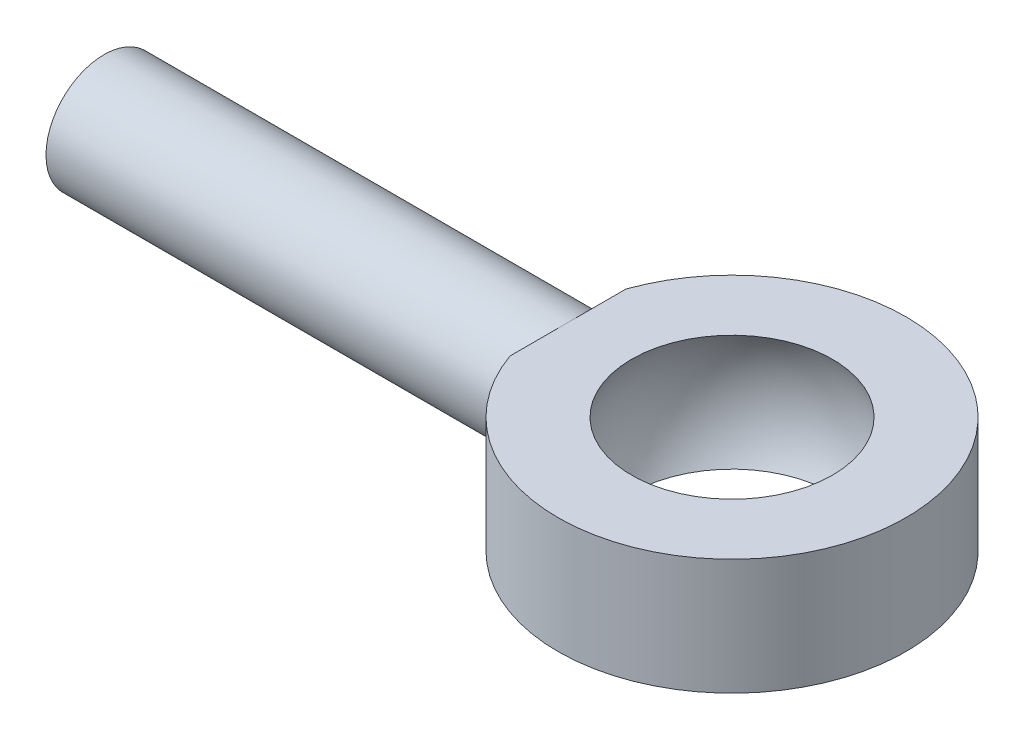
ISO-10303-21;
HEADER;
FILE_DESCRIPTION(('STEP AP214'),'2;1');
FILE_NAME('part.step','',(''),(''),'','','');
FILE_SCHEMA(('AUTOMOTIVE_DESIGN { 1 0 10303 214 1 1 1 1 }'));
ENDSEC;
DATA;
#1=APPLICATION_CONTEXT('core data for automotive mechanical design processes');
#2=APPLICATION_PROTOCOL_DEFINITION('international standard','automotive_design',2000,#1);
#3=PRODUCT_CONTEXT('',#1,'mechanical');
#4=PRODUCT('Part','Part','',(#3));
#5=PRODUCT_RELATED_PRODUCT_CATEGORY('part','',(#4));
#6=PRODUCT_DEFINITION_FORMATION('','',#4);
#7=PRODUCT_DEFINITION_CONTEXT('part definition',#1,'design');
#8=PRODUCT_DEFINITION('design','',#6,#7);
#9=PRODUCT_DEFINITION_SHAPE('','',#8);
#10=(LENGTH_UNIT() NAMED_UNIT(*) SI_UNIT(.MILLI.,.METRE.));
#11=(NAMED_UNIT(*) PLANE_ANGLE_UNIT() SI_UNIT($,.RADIAN.));
#12=(NAMED_UNIT(*) SI_UNIT($,.STERADIAN.) SOLID_ANGLE_UNIT());
#13=UNCERTAINTY_MEASURE_WITH_UNIT(LENGTH_MEASURE(1.E-05),#10,'distance_accuracy_value','');
#14=(GEOMETRIC_REPRESENTATION_CONTEXT(3) GLOBAL_UNCERTAINTY_ASSIGNED_CONTEXT((#13)) GLOBAL_UNIT_ASSIGNED_CONTEXT((#10,
#11,#12)) REPRESENTATION_CONTEXT('',''));
#15=CARTESIAN_POINT('',(0.,0.,0.));
#16=DIRECTION('',(0.,0.,1.));
#17=DIRECTION('',(1.,0.,0.));
#18=AXIS2_PLACEMENT_3D('',#15,#16,#17);
#19=CARTESIAN_POINT('',(0.,6.35,0.));
#20=DIRECTION('',(0.,-1.,0.));
#21=DIRECTION('',(0.,0.,-1.));
#22=AXIS2_PLACEMENT_3D('',#19,#20,#21);
#23=PLANE('',#22);
#24=CARTESIAN_POINT('',(0.,6.35,0.));
#25=DIRECTION('',(0.,1.,0.));
#26=DIRECTION('',(0.,0.,-1.));
#27=AXIS2_PLACEMENT_3D('',#24,#25,#26);
#28=CIRCLE('',#27,9.525);
#29=CARTESIAN_POINT('',(-8.98025612106915,6.35,3.175));
#30=VERTEX_POINT('',#29);
#31=CARTESIAN_POINT('',(-8.98025612106915,6.35,-3.175));
#32=VERTEX_POINT('',#31);
#33=EDGE_CURVE('E101',#30,#32,#28,.T.);
#34=ORIENTED_EDGE('',*,*,#33,.T.);
#35=DIRECTION('',(0.,0.,1.));
#36=VECTOR('',#35,1.);
#37=CARTESIAN_POINT('',(-8.98025612106915,6.35,-3.175));
#38=LINE('',#37,#36);
#39=CARTESIAN_POINT('',(-8.98025612106915,6.35,0.));
#40=VERTEX_POINT('',#39);
#41=EDGE_CURVE('E76',#32,#40,#38,.T.);
#42=ORIENTED_EDGE('',*,*,#41,.T.);
#43=EDGE_CURVE('E103',#40,#30,#38,.T.);
#44=ORIENTED_EDGE('',*,*,#43,.T.);
#45=EDGE_LOOP('',(#34,#42,#44));
#46=FACE_BOUND('',#45,.T.);
#47=CARTESIAN_POINT('',(0.,6.35,0.));
#48=DIRECTION('',(0.,-1.,0.));
#49=DIRECTION('',(0.,0.,-1.));
#50=AXIS2_PLACEMENT_3D('',#47,#48,#49);
#51=CIRCLE('',#50,5.49926131403118);
#52=CARTESIAN_POINT('',(5.49926131403118,6.35,0.));
#53=VERTEX_POINT('',#52);
#54=EDGE_CURVE('E122',#53,#53,#51,.F.);
#55=ORIENTED_EDGE('',*,*,#54,.F.);
#56=EDGE_LOOP('',(#55));
#57=FACE_BOUND('',#56,.T.);
#58=ADVANCED_FACE('F33',(#46,#57),#23,.F.);
#59=CARTESIAN_POINT('',(0.,0.,0.));
#60=DIRECTION('',(0.,-1.,0.));
#61=DIRECTION('',(0.,0.,-1.));
#62=AXIS2_PLACEMENT_3D('',#59,#60,#61);
#63=PLANE('',#62);
#64=CARTESIAN_POINT('',(0.,0.,0.));
#65=DIRECTION('',(0.,1.,0.));
#66=DIRECTION('',(0.,0.,-1.));
#67=AXIS2_PLACEMENT_3D('',#64,#65,#66);
#68=CIRCLE('',#67,9.525);
#69=CARTESIAN_POINT('',(-8.98025612106915,0.,3.175));
#70=VERTEX_POINT('',#69);
#71=CARTESIAN_POINT('',(-8.98025612106915,0.,-3.175));
#72=VERTEX_POINT('',#71);
#73=EDGE_CURVE('E83',#70,#72,#68,.T.);
#74=ORIENTED_EDGE('',*,*,#73,.F.);
#75=DIRECTION('',(0.,0.,1.));
#76=VECTOR('',#75,1.);
#77=CARTESIAN_POINT('',(-8.98025612106915,0.,-3.175));
#78=LINE('',#77,#76);
#79=CARTESIAN_POINT('',(-8.98025612106915,0.,0.));
#80=VERTEX_POINT('',#79);
#81=EDGE_CURVE('E107',#80,#70,#78,.T.);
#82=ORIENTED_EDGE('',*,*,#81,.F.);
#83=EDGE_CURVE('E91',#72,#80,#78,.T.);
#84=ORIENTED_EDGE('',*,*,#83,.F.);
#85=EDGE_LOOP('',(#74,#82,#84));
#86=FACE_BOUND('',#85,.T.);
#87=CARTESIAN_POINT('',(0.,0.,0.));
#88=DIRECTION('',(0.,-1.,0.));
#89=DIRECTION('',(0.,0.,-1.));
#90=AXIS2_PLACEMENT_3D('',#87,#88,#89);
#91=CIRCLE('',#90,5.49926131403118);
#92=CARTESIAN_POINT('',(5.49926131403118,0.,0.));
#93=VERTEX_POINT('',#92);
#94=EDGE_CURVE('E37',#93,#93,#91,.F.);
#95=ORIENTED_EDGE('',*,*,#94,.T.);
#96=EDGE_LOOP('',(#95));
#97=FACE_BOUND('',#96,.T.);
#98=ADVANCED_FACE('F115',(#86,#97),#63,.T.);
#99=CARTESIAN_POINT('',(-8.98025612106915,6.35,-3.175));
#100=DIRECTION('',(1.,0.,0.));
#101=DIRECTION('',(0.,0.,-1.));
#102=AXIS2_PLACEMENT_3D('',#99,#100,#101);
#103=PLANE('',#102);
#104=CARTESIAN_POINT('',(-8.98025612106915,3.175,0.));
#105=DIRECTION('',(-1.,0.,0.));
#106=DIRECTION('',(0.,0.,1.));
#107=AXIS2_PLACEMENT_3D('',#104,#105,#106);
#108=CIRCLE('',#107,3.175);
#109=CARTESIAN_POINT('',(-8.98025612106915,3.175,-3.175));
#110=VERTEX_POINT('',#109);
#111=EDGE_CURVE('E89',#110,#80,#108,.T.);
#112=ORIENTED_EDGE('',*,*,#111,.F.);
#113=DIRECTION('',(0.,-1.,0.));
#114=VECTOR('',#113,1.);
#115=CARTESIAN_POINT('',(-8.98025612106915,6.35,-3.175));
#116=LINE('',#115,#114);
#117=EDGE_CURVE('E42',#110,#72,#116,.T.);
#118=ORIENTED_EDGE('',*,*,#117,.T.);
#119=ORIENTED_EDGE('',*,*,#83,.T.);
#120=EDGE_LOOP('',(#112,#118,#119));
#121=FACE_BOUND('',#120,.T.);
#122=ADVANCED_FACE('F90',(#121),#103,.F.);
#123=CARTESIAN_POINT('',(-8.98025612106915,3.175,3.175));
#124=VERTEX_POINT('',#123);
#125=EDGE_CURVE('E94',#80,#124,#108,.T.);
#126=ORIENTED_EDGE('',*,*,#125,.F.);
#127=ORIENTED_EDGE('',*,*,#81,.T.);
#128=DIRECTION('',(0.,-1.,0.));
#129=VECTOR('',#128,1.);
#130=CARTESIAN_POINT('',(-8.98025612106915,6.35,3.175));
#131=LINE('',#130,#129);
#132=EDGE_CURVE('E105',#124,#70,#131,.T.);
#133=ORIENTED_EDGE('',*,*,#132,.F.);
#134=EDGE_LOOP('',(#126,#127,#133));
#135=FACE_BOUND('',#134,.T.);
#136=ADVANCED_FACE('F113',(#135),#103,.F.);
#137=EDGE_CURVE('E49',#124,#40,#108,.T.);
#138=ORIENTED_EDGE('',*,*,#137,.F.);
#139=EDGE_CURVE('E87',#30,#124,#131,.T.);
#140=ORIENTED_EDGE('',*,*,#139,.F.);
#141=ORIENTED_EDGE('',*,*,#43,.F.);
#142=EDGE_LOOP('',(#138,#140,#141));
#143=FACE_BOUND('',#142,.T.);
#144=ADVANCED_FACE('F139',(#143),#103,.F.);
#145=EDGE_CURVE('E56',#40,#110,#108,.T.);
#146=ORIENTED_EDGE('',*,*,#145,.F.);
#147=ORIENTED_EDGE('',*,*,#41,.F.);
#148=EDGE_CURVE('E11',#32,#110,#116,.T.);
#149=ORIENTED_EDGE('',*,*,#148,.T.);
#150=EDGE_LOOP('',(#146,#147,#149));
#151=FACE_BOUND('',#150,.T.);
#152=ADVANCED_FACE('F74',(#151),#103,.F.);
#153=CARTESIAN_POINT('',(0.,6.35,0.));
#154=DIRECTION('',(0.,-1.,0.));
#155=DIRECTION('',(0.,0.,-1.));
#156=AXIS2_PLACEMENT_3D('',#153,#154,#155);
#157=CYLINDRICAL_SURFACE('',#156,9.525);
#158=ORIENTED_EDGE('',*,*,#73,.T.);
#159=ORIENTED_EDGE('',*,*,#117,.F.);
#160=ORIENTED_EDGE('',*,*,#148,.F.);
#161=ORIENTED_EDGE('',*,*,#33,.F.);
#162=ORIENTED_EDGE('',*,*,#139,.T.);
#163=ORIENTED_EDGE('',*,*,#132,.T.);
#164=EDGE_LOOP('',(#158,#159,#160,#161,#162,#163));
#165=FACE_BOUND('',#164,.T.);
#166=ADVANCED_FACE('F35',(#165),#157,.T.);
#167=CARTESIAN_POINT('',(-34.3802561210692,3.175,0.));
#168=DIRECTION('',(1.,0.,0.));
#169=DIRECTION('',(0.,0.,-1.));
#170=AXIS2_PLACEMENT_3D('',#167,#168,#169);
#171=CYLINDRICAL_SURFACE('',#170,3.175);
#172=CARTESIAN_POINT('',(-34.3802561210692,3.175,0.));
#173=DIRECTION('',(-1.,0.,0.));
#174=DIRECTION('',(0.,0.,1.));
#175=AXIS2_PLACEMENT_3D('',#172,#173,#174);
#176=CIRCLE('',#175,3.175);
#177=CARTESIAN_POINT('',(-34.3802561210692,3.175,3.175));
#178=VERTEX_POINT('',#177);
#179=EDGE_CURVE('E97',#178,#178,#176,.T.);
#180=ORIENTED_EDGE('',*,*,#179,.F.);
#181=EDGE_LOOP('',(#180));
#182=FACE_BOUND('',#181,.T.);
#183=ORIENTED_EDGE('',*,*,#137,.T.);
#184=ORIENTED_EDGE('',*,*,#145,.T.);
#185=ORIENTED_EDGE('',*,*,#111,.T.);
#186=ORIENTED_EDGE('',*,*,#125,.T.);
#187=EDGE_LOOP('',(#183,#184,#185,#186));
#188=FACE_BOUND('',#187,.T.);
#189=ADVANCED_FACE('F96',(#182,#188),#171,.T.);
#190=CARTESIAN_POINT('',(-34.3802561210692,3.175,0.));
#191=DIRECTION('',(-1.,0.,0.));
#192=DIRECTION('',(0.,0.,1.));
#193=AXIS2_PLACEMENT_3D('',#190,#191,#192);
#194=PLANE('',#193);
#195=ORIENTED_EDGE('',*,*,#179,.T.);
#196=EDGE_LOOP('',(#195));
#197=FACE_BOUND('',#196,.T.);
#198=ADVANCED_FACE('F165',(#197),#194,.T.);
#199=CARTESIAN_POINT('',(0.,3.175,0.));
#200=DIRECTION('',(0.,1.,0.));
#201=DIRECTION('',(1.,0.,0.));
#202=AXIS2_PLACEMENT_3D('',#199,#200,#201);
#203=SPHERICAL_SURFACE('',#202,6.35);
#204=CARTESIAN_POINT('',(5.49926131403118,0.,0.));
#205=CARTESIAN_POINT('',(5.53389557557169,0.0599874293659762,0.));
#206=CARTESIAN_POINT('',(5.5675475382969,0.12054196069382,0.));
#207=CARTESIAN_POINT('',(5.63285251892721,0.242719481616011,0.));
#208=CARTESIAN_POINT('',(5.6645055368323,0.304342471210358,0.));
#209=CARTESIAN_POINT('',(5.72577828063284,0.428591163008326,0.));
#210=CARTESIAN_POINT('',(5.75539800652828,0.491216865211946,0.));
#211=CARTESIAN_POINT('',(5.81257256997065,0.61740385627224,0.));
#212=CARTESIAN_POINT('',(5.84012740751757,0.680965145128914,0.));
#213=CARTESIAN_POINT('',(5.89314265537577,0.808955263834446,0.));
#214=CARTESIAN_POINT('',(5.91860306568703,0.873384093683304,0.));
#215=CARTESIAN_POINT('',(5.967402204131,1.00304029771703,0.));
#216=CARTESIAN_POINT('',(5.9907409322637,1.0682676719019,0.));
#217=CARTESIAN_POINT('',(6.03527171232414,1.19945111874795,0.));
#218=CARTESIAN_POINT('',(6.05646376425188,1.26540719140912,0.));
#219=CARTESIAN_POINT('',(6.09667849954717,1.3979774074592,0.));
#220=CARTESIAN_POINT('',(6.11570118291473,1.46459155084811,0.));
#221=CARTESIAN_POINT('',(6.15155681095644,1.59840657634988,0.));
#222=CARTESIAN_POINT('',(6.16838975563059,1.66560745846275,0.));
#223=CARTESIAN_POINT('',(6.19984788119155,1.80052400100071,0.));
#224=CARTESIAN_POINT('',(6.21447306207837,1.86823966142581,0.));
#225=CARTESIAN_POINT('',(6.24149999904265,2.00411324896937,0.));
#226=CARTESIAN_POINT('',(6.25390175512011,2.07227117608783,0.));
#227=CARTESIAN_POINT('',(6.27646856235785,2.20895631180089,0.));
#228=CARTESIAN_POINT('',(6.28663361351813,2.27748352039548,0.));
#229=CARTESIAN_POINT('',(6.30471612592926,2.41483383840986,0.));
#230=CARTESIAN_POINT('',(6.31263358718011,2.48365694782966,0.));
#231=CARTESIAN_POINT('',(6.32621244155679,2.62152536998492,0.));
#232=CARTESIAN_POINT('',(6.33187383468262,2.6905706827204,0.));
#233=CARTESIAN_POINT('',(6.34093449044764,2.82880957605679,0.));
#234=CARTESIAN_POINT('',(6.34433375308683,2.8980031566577,0.));
#235=CARTESIAN_POINT('',(6.34886650786301,3.03646449150574,0.));
#236=CARTESIAN_POINT('',(6.35,3.10573224575287,0.));
#237=CARTESIAN_POINT('',(6.35,3.24426775424713,0.));
#238=CARTESIAN_POINT('',(6.34886650786301,3.31353550849426,0.));
#239=CARTESIAN_POINT('',(6.34433375308683,3.4519968433423,0.));
#240=CARTESIAN_POINT('',(6.34093449044764,3.52119042394321,0.));
#241=CARTESIAN_POINT('',(6.33187383468262,3.6594293172796,0.));
#242=CARTESIAN_POINT('',(6.32621244155679,3.72847463001508,0.));
#243=CARTESIAN_POINT('',(6.31263358718011,3.86634305217034,0.));
#244=CARTESIAN_POINT('',(6.30471612592926,3.93516616159014,0.));
#245=CARTESIAN_POINT('',(6.28663361351813,4.07251647960452,0.));
#246=CARTESIAN_POINT('',(6.27646856235785,4.14104368819911,0.));
#247=CARTESIAN_POINT('',(6.25390175512011,4.27772882391217,0.));
#248=CARTESIAN_POINT('',(6.24149999904265,4.34588675103064,0.));
#249=CARTESIAN_POINT('',(6.21447306207837,4.4817603385742,0.));
#250=CARTESIAN_POINT('',(6.19984788119155,4.54947599899929,0.));
#251=CARTESIAN_POINT('',(6.16838975563059,4.68439254153725,0.));
#252=CARTESIAN_POINT('',(6.15155681095644,4.75159342365012,0.));
#253=CARTESIAN_POINT('',(6.11570118291473,4.88540844915189,0.));
#254=CARTESIAN_POINT('',(6.09667849954717,4.9520225925408,0.));
#255=CARTESIAN_POINT('',(6.05646376425188,5.08459280859088,0.));
#256=CARTESIAN_POINT('',(6.03527171232414,5.15054888125205,0.));
#257=CARTESIAN_POINT('',(5.9907409322637,5.2817323280981,0.));
#258=CARTESIAN_POINT('',(5.967402204131,5.34695970228297,0.));
#259=CARTESIAN_POINT('',(5.91860306568703,5.4766159063167,0.));
#260=CARTESIAN_POINT('',(5.89314265537577,5.54104473616555,0.));
#261=CARTESIAN_POINT('',(5.84012740751757,5.66903485487109,0.));
#262=CARTESIAN_POINT('',(5.81257256997065,5.73259614372776,0.));
#263=CARTESIAN_POINT('',(5.75539800652828,5.85878313478805,0.));
#264=CARTESIAN_POINT('',(5.72577828063284,5.92140883699167,0.));
#265=CARTESIAN_POINT('',(5.6645055368323,6.04565752878964,0.));
#266=CARTESIAN_POINT('',(5.63285251892721,6.10728051838399,0.));
#267=CARTESIAN_POINT('',(5.5675475382969,6.22945803930618,0.));
#268=CARTESIAN_POINT('',(5.53389557557169,6.29001257063402,0.));
#269=CARTESIAN_POINT('',(5.49926131403118,6.35,0.));
#270=B_SPLINE_CURVE_WITH_KNOTS('',3,(#204,#205,#206,#207,#208,#209,#210,#211,#212,#213,#214,
#215,#216,#217,#218,#219,#220,#221,#222,#223,#224,#225,#226,#227,#228,#229,#230,#231,#232,#233,
#234,#235,#236,#237,#238,#239,#240,#241,#242,#243,#244,#245,#246,#247,#248,#249,#250,#251,#252,
#253,#254,#255,#256,#257,#258,#259,#260,#261,#262,#263,#264,#265,#266,#267,#268,#269),
.UNSPECIFIED.,.F.,.F.,(4,2,2,2,2,2,2,2,2,2,2,2,2,2,2,2,2,2,2,2,2,2,2,2,2,2,2,2,2,2,2,2,4),(0.,
0.207793991656382,0.415587983312764,0.623381974969146,0.831175966625528,1.03896995828191,
1.24676394993829,1.45455794159467,1.66235193325106,1.87014592490744,2.07793991656382,
2.2857339082202,2.49352789987659,2.70132189153297,2.90911588318935,3.11690987484573,
3.32470386650211,3.5324978581585,3.74029184981488,3.94808584147126,4.15587983312764,
4.36367382478402,4.57146781644041,4.77926180809679,4.98705579975317,5.19484979140955,
5.40264378306594,5.61043777472232,5.8182317663787,6.02602575803508,6.23381974969146,
6.44161374134785,6.64940773300423),.UNSPECIFIED.);
#271=EDGE_CURVE('BSEAM126',#93,#53,#270,.T.);
#272=ORIENTED_EDGE('',*,*,#94,.F.);
#273=ORIENTED_EDGE('',*,*,#54,.T.);
#274=ORIENTED_EDGE('',*,*,#271,.T.);
#275=ORIENTED_EDGE('',*,*,#271,.F.);
#276=EDGE_LOOP('',(#272,#274,#273,#275));
#277=FACE_BOUND('',#276,.T.);
#278=ADVANCED_FACE('F126',(#277),#203,.F.);
#279=CLOSED_SHELL('',(#58,#98,#122,#136,#144,#152,#166,#189,#198,#278));
#280=MANIFOLD_SOLID_BREP('B2',#279);
#281=ADVANCED_BREP_SHAPE_REPRESENTATION('',(#18,#280),#14);
#282=SHAPE_DEFINITION_REPRESENTATION(#9,#281);
ENDSEC;
END-ISO-10303-21;
